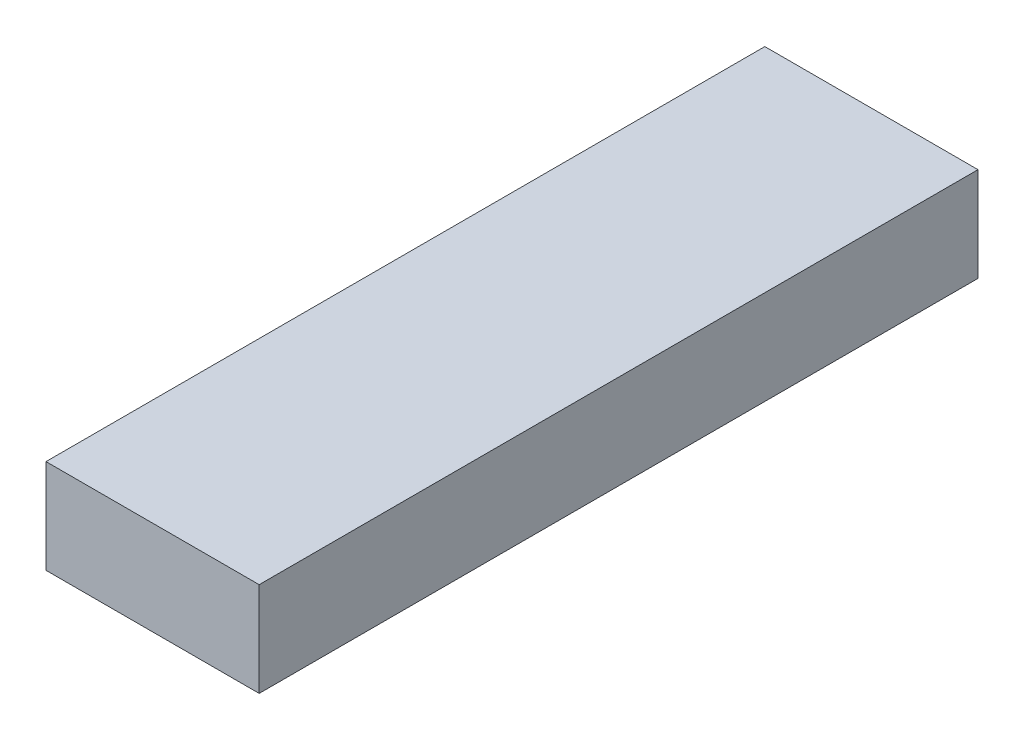
ISO-10303-21;
HEADER;
FILE_DESCRIPTION(('STEP AP214'),'2;1');
FILE_NAME('part.step','',(''),(''),'','','');
FILE_SCHEMA(('AUTOMOTIVE_DESIGN { 1 0 10303 214 1 1 1 1 }'));
ENDSEC;
DATA;
#1=APPLICATION_CONTEXT('core data for automotive mechanical design processes');
#2=APPLICATION_PROTOCOL_DEFINITION('international standard','automotive_design',2000,#1);
#3=PRODUCT_CONTEXT('',#1,'mechanical');
#4=PRODUCT('Part','Part','',(#3));
#5=PRODUCT_RELATED_PRODUCT_CATEGORY('part','',(#4));
#6=PRODUCT_DEFINITION_FORMATION('','',#4);
#7=PRODUCT_DEFINITION_CONTEXT('part definition',#1,'design');
#8=PRODUCT_DEFINITION('design','',#6,#7);
#9=PRODUCT_DEFINITION_SHAPE('','',#8);
#10=(LENGTH_UNIT() NAMED_UNIT(*) SI_UNIT(.MILLI.,.METRE.));
#11=(NAMED_UNIT(*) PLANE_ANGLE_UNIT() SI_UNIT($,.RADIAN.));
#12=(NAMED_UNIT(*) SI_UNIT($,.STERADIAN.) SOLID_ANGLE_UNIT());
#13=UNCERTAINTY_MEASURE_WITH_UNIT(LENGTH_MEASURE(1.E-05),#10,'distance_accuracy_value','');
#14=(GEOMETRIC_REPRESENTATION_CONTEXT(3) GLOBAL_UNCERTAINTY_ASSIGNED_CONTEXT((#13)) GLOBAL_UNIT_ASSIGNED_CONTEXT((#10,
#11,#12)) REPRESENTATION_CONTEXT('',''));
#15=CARTESIAN_POINT('',(0.,0.,0.));
#16=DIRECTION('',(0.,0.,1.));
#17=DIRECTION('',(1.,0.,0.));
#18=AXIS2_PLACEMENT_3D('',#15,#16,#17);
#19=CARTESIAN_POINT('',(-21.5,19.,-72.5));
#20=DIRECTION('',(1.,0.,0.));
#21=DIRECTION('',(0.,0.,-1.));
#22=AXIS2_PLACEMENT_3D('',#19,#20,#21);
#23=PLANE('',#22);
#24=DIRECTION('',(0.,0.,1.));
#25=VECTOR('',#24,1.);
#26=CARTESIAN_POINT('',(-21.5,0.,-72.5));
#27=LINE('',#26,#25);
#28=CARTESIAN_POINT('',(-21.5,0.,-72.5));
#29=VERTEX_POINT('',#28);
#30=CARTESIAN_POINT('',(-21.5,0.,72.5));
#31=VERTEX_POINT('',#30);
#32=EDGE_CURVE('E96',#29,#31,#27,.T.);
#33=ORIENTED_EDGE('',*,*,#32,.T.);
#34=DIRECTION('',(0.,-1.,0.));
#35=VECTOR('',#34,1.);
#36=CARTESIAN_POINT('',(-21.5,19.,72.5));
#37=LINE('',#36,#35);
#38=CARTESIAN_POINT('',(-21.5,19.,72.5));
#39=VERTEX_POINT('',#38);
#40=EDGE_CURVE('E11',#39,#31,#37,.T.);
#41=ORIENTED_EDGE('',*,*,#40,.F.);
#42=DIRECTION('',(0.,0.,1.));
#43=VECTOR('',#42,1.);
#44=CARTESIAN_POINT('',(-21.5,19.,-72.5));
#45=LINE('',#44,#43);
#46=CARTESIAN_POINT('',(-21.5,19.,-72.5));
#47=VERTEX_POINT('',#46);
#48=EDGE_CURVE('E84',#47,#39,#45,.T.);
#49=ORIENTED_EDGE('',*,*,#48,.F.);
#50=DIRECTION('',(0.,-1.,0.));
#51=VECTOR('',#50,1.);
#52=CARTESIAN_POINT('',(-21.5,19.,-72.5));
#53=LINE('',#52,#51);
#54=EDGE_CURVE('E92',#47,#29,#53,.T.);
#55=ORIENTED_EDGE('',*,*,#54,.T.);
#56=EDGE_LOOP('',(#33,#41,#49,#55));
#57=FACE_BOUND('',#56,.T.);
#58=ADVANCED_FACE('F33',(#57),#23,.F.);
#59=CARTESIAN_POINT('',(21.5,19.,72.5));
#60=DIRECTION('',(0.,0.,-1.));
#61=DIRECTION('',(-1.,0.,0.));
#62=AXIS2_PLACEMENT_3D('',#59,#60,#61);
#63=PLANE('',#62);
#64=DIRECTION('',(1.,0.,0.));
#65=VECTOR('',#64,1.);
#66=CARTESIAN_POINT('',(21.5,0.,72.5));
#67=LINE('',#66,#65);
#68=CARTESIAN_POINT('',(21.5,0.,72.5));
#69=VERTEX_POINT('',#68);
#70=EDGE_CURVE('E88',#31,#69,#67,.T.);
#71=ORIENTED_EDGE('',*,*,#70,.T.);
#72=DIRECTION('',(0.,-1.,0.));
#73=VECTOR('',#72,1.);
#74=CARTESIAN_POINT('',(21.5,19.,72.5));
#75=LINE('',#74,#73);
#76=CARTESIAN_POINT('',(21.5,19.,72.5));
#77=VERTEX_POINT('',#76);
#78=EDGE_CURVE('E41',#77,#69,#75,.T.);
#79=ORIENTED_EDGE('',*,*,#78,.F.);
#80=DIRECTION('',(1.,0.,0.));
#81=VECTOR('',#80,1.);
#82=CARTESIAN_POINT('',(21.5,19.,72.5));
#83=LINE('',#82,#81);
#84=EDGE_CURVE('E79',#39,#77,#83,.T.);
#85=ORIENTED_EDGE('',*,*,#84,.F.);
#86=ORIENTED_EDGE('',*,*,#40,.T.);
#87=EDGE_LOOP('',(#71,#79,#85,#86));
#88=FACE_BOUND('',#87,.T.);
#89=ADVANCED_FACE('F87',(#88),#63,.F.);
#90=CARTESIAN_POINT('',(21.5,19.,-72.5));
#91=DIRECTION('',(-1.,0.,0.));
#92=DIRECTION('',(0.,0.,1.));
#93=AXIS2_PLACEMENT_3D('',#90,#91,#92);
#94=PLANE('',#93);
#95=DIRECTION('',(0.,0.,-1.));
#96=VECTOR('',#95,1.);
#97=CARTESIAN_POINT('',(21.5,0.,-72.5));
#98=LINE('',#97,#96);
#99=CARTESIAN_POINT('',(21.5,0.,-72.5));
#100=VERTEX_POINT('',#99);
#101=EDGE_CURVE('E66',#69,#100,#98,.T.);
#102=ORIENTED_EDGE('',*,*,#101,.T.);
#103=DIRECTION('',(0.,-1.,0.));
#104=VECTOR('',#103,1.);
#105=CARTESIAN_POINT('',(21.5,19.,-72.5));
#106=LINE('',#105,#104);
#107=CARTESIAN_POINT('',(21.5,19.,-72.5));
#108=VERTEX_POINT('',#107);
#109=EDGE_CURVE('E89',#108,#100,#106,.T.);
#110=ORIENTED_EDGE('',*,*,#109,.F.);
#111=DIRECTION('',(0.,0.,-1.));
#112=VECTOR('',#111,1.);
#113=CARTESIAN_POINT('',(21.5,19.,-72.5));
#114=LINE('',#113,#112);
#115=EDGE_CURVE('E82',#77,#108,#114,.T.);
#116=ORIENTED_EDGE('',*,*,#115,.F.);
#117=ORIENTED_EDGE('',*,*,#78,.T.);
#118=EDGE_LOOP('',(#102,#110,#116,#117));
#119=FACE_BOUND('',#118,.T.);
#120=ADVANCED_FACE('F90',(#119),#94,.F.);
#121=CARTESIAN_POINT('',(21.5,19.,-72.5));
#122=DIRECTION('',(0.,0.,1.));
#123=DIRECTION('',(1.,0.,0.));
#124=AXIS2_PLACEMENT_3D('',#121,#122,#123);
#125=PLANE('',#124);
#126=DIRECTION('',(-1.,0.,0.));
#127=VECTOR('',#126,1.);
#128=CARTESIAN_POINT('',(21.5,0.,-72.5));
#129=LINE('',#128,#127);
#130=EDGE_CURVE('E72',#100,#29,#129,.T.);
#131=ORIENTED_EDGE('',*,*,#130,.T.);
#132=ORIENTED_EDGE('',*,*,#54,.F.);
#133=DIRECTION('',(-1.,0.,0.));
#134=VECTOR('',#133,1.);
#135=CARTESIAN_POINT('',(21.5,19.,-72.5));
#136=LINE('',#135,#134);
#137=EDGE_CURVE('E49',#108,#47,#136,.T.);
#138=ORIENTED_EDGE('',*,*,#137,.F.);
#139=ORIENTED_EDGE('',*,*,#109,.T.);
#140=EDGE_LOOP('',(#131,#132,#138,#139));
#141=FACE_BOUND('',#140,.T.);
#142=ADVANCED_FACE('F103',(#141),#125,.F.);
#143=CARTESIAN_POINT('',(0.,19.,0.));
#144=DIRECTION('',(0.,-1.,0.));
#145=DIRECTION('',(0.,0.,-1.));
#146=AXIS2_PLACEMENT_3D('',#143,#144,#145);
#147=PLANE('',#146);
#148=ORIENTED_EDGE('',*,*,#48,.T.);
#149=ORIENTED_EDGE('',*,*,#84,.T.);
#150=ORIENTED_EDGE('',*,*,#115,.T.);
#151=ORIENTED_EDGE('',*,*,#137,.T.);
#152=EDGE_LOOP('',(#148,#149,#150,#151));
#153=FACE_BOUND('',#152,.T.);
#154=ADVANCED_FACE('F80',(#153),#147,.F.);
#155=CARTESIAN_POINT('',(0.,0.,0.));
#156=DIRECTION('',(0.,-1.,0.));
#157=DIRECTION('',(0.,0.,-1.));
#158=AXIS2_PLACEMENT_3D('',#155,#156,#157);
#159=PLANE('',#158);
#160=ORIENTED_EDGE('',*,*,#32,.F.);
#161=ORIENTED_EDGE('',*,*,#130,.F.);
#162=ORIENTED_EDGE('',*,*,#101,.F.);
#163=ORIENTED_EDGE('',*,*,#70,.F.);
#164=EDGE_LOOP('',(#160,#161,#162,#163));
#165=FACE_BOUND('',#164,.T.);
#166=ADVANCED_FACE('F106',(#165),#159,.T.);
#167=CLOSED_SHELL('',(#58,#89,#120,#142,#154,#166));
#168=MANIFOLD_SOLID_BREP('B2',#167);
#169=ADVANCED_BREP_SHAPE_REPRESENTATION('',(#18,#168),#14);
#170=SHAPE_DEFINITION_REPRESENTATION(#9,#169);
ENDSEC;
END-ISO-10303-21;
